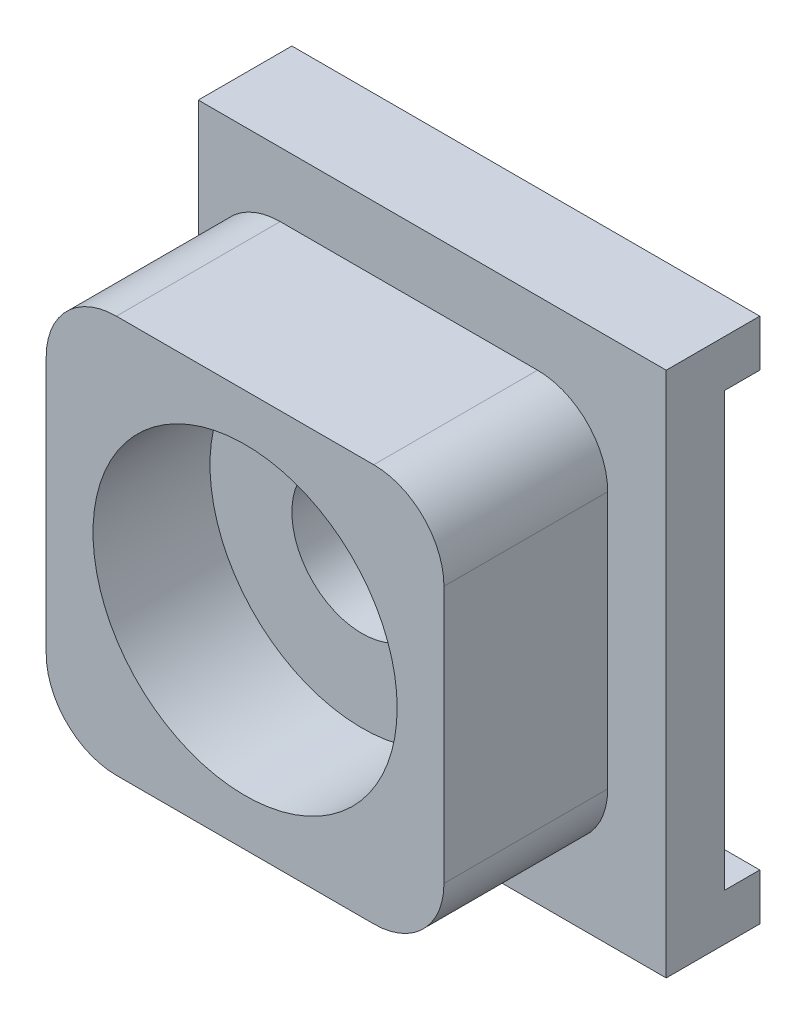
ISO-10303-21;
HEADER;
FILE_DESCRIPTION(('STEP AP214'),'2;1');
FILE_NAME('part.step','',(''),(''),'','','');
FILE_SCHEMA(('AUTOMOTIVE_DESIGN { 1 0 10303 214 1 1 1 1 }'));
ENDSEC;
DATA;
#1=APPLICATION_CONTEXT('core data for automotive mechanical design processes');
#2=APPLICATION_PROTOCOL_DEFINITION('international standard','automotive_design',2000,#1);
#3=PRODUCT_CONTEXT('',#1,'mechanical');
#4=PRODUCT('Part','Part','',(#3));
#5=PRODUCT_RELATED_PRODUCT_CATEGORY('part','',(#4));
#6=PRODUCT_DEFINITION_FORMATION('','',#4);
#7=PRODUCT_DEFINITION_CONTEXT('part definition',#1,'design');
#8=PRODUCT_DEFINITION('design','',#6,#7);
#9=PRODUCT_DEFINITION_SHAPE('','',#8);
#10=(LENGTH_UNIT() NAMED_UNIT(*) SI_UNIT(.MILLI.,.METRE.));
#11=(NAMED_UNIT(*) PLANE_ANGLE_UNIT() SI_UNIT($,.RADIAN.));
#12=(NAMED_UNIT(*) SI_UNIT($,.STERADIAN.) SOLID_ANGLE_UNIT());
#13=UNCERTAINTY_MEASURE_WITH_UNIT(LENGTH_MEASURE(1.E-05),#10,'distance_accuracy_value','');
#14=(GEOMETRIC_REPRESENTATION_CONTEXT(3) GLOBAL_UNCERTAINTY_ASSIGNED_CONTEXT((#13)) GLOBAL_UNIT_ASSIGNED_CONTEXT((#10,
#11,#12)) REPRESENTATION_CONTEXT('',''));
#15=CARTESIAN_POINT('',(0.,0.,0.));
#16=DIRECTION('',(0.,0.,1.));
#17=DIRECTION('',(1.,0.,0.));
#18=AXIS2_PLACEMENT_3D('',#15,#16,#17);
#19=CARTESIAN_POINT('',(9.,-32.1161163460147,-3.28538808507393));
#20=DIRECTION('',(0.,0.,1.));
#21=DIRECTION('',(1.,0.,0.));
#22=AXIS2_PLACEMENT_3D('',#19,#20,#21);
#23=CYLINDRICAL_SURFACE('',#22,3.);
#24=CARTESIAN_POINT('',(9.,-32.1161163460147,-2.78538808507393));
#25=DIRECTION('',(0.,0.,1.));
#26=DIRECTION('',(0.,-1.,0.));
#27=AXIS2_PLACEMENT_3D('',#24,#25,#26);
#28=CIRCLE('',#27,3.);
#29=CARTESIAN_POINT('',(9.,-35.1161163460147,-2.78538808507393));
#30=VERTEX_POINT('',#29);
#31=EDGE_CURVE('E245',#30,#30,#28,.T.);
#32=ORIENTED_EDGE('',*,*,#31,.F.);
#33=EDGE_LOOP('',(#32));
#34=FACE_BOUND('',#33,.T.);
#35=CARTESIAN_POINT('',(9.,-32.1161163460147,1.71461191492607));
#36=DIRECTION('',(0.,0.,1.));
#37=DIRECTION('',(1.,0.,0.));
#38=AXIS2_PLACEMENT_3D('',#35,#36,#37);
#39=CIRCLE('',#38,3.);
#40=CARTESIAN_POINT('',(12.,-32.1161163460147,1.71461191492607));
#41=VERTEX_POINT('',#40);
#42=EDGE_CURVE('E178',#41,#41,#39,.F.);
#43=ORIENTED_EDGE('',*,*,#42,.F.);
#44=EDGE_LOOP('',(#43));
#45=FACE_BOUND('',#44,.T.);
#46=ADVANCED_FACE('F33',(#34,#45),#23,.F.);
#47=CARTESIAN_POINT('',(20.,-20.8661163460147,-0.285388085073932));
#48=DIRECTION('',(0.,0.,-1.));
#49=DIRECTION('',(0.,1.,0.));
#50=AXIS2_PLACEMENT_3D('',#47,#48,#49);
#51=PLANE('',#50);
#52=DIRECTION('',(0.,-1.,0.));
#53=VECTOR('',#52,1.);
#54=CARTESIAN_POINT('',(0.,-20.8661163460147,-0.285388085073932));
#55=LINE('',#54,#53);
#56=CARTESIAN_POINT('',(0.,-20.8661163460147,-0.285388085073932));
#57=VERTEX_POINT('',#56);
#58=CARTESIAN_POINT('',(0.,-43.3661163460147,-0.285388085073934));
#59=VERTEX_POINT('',#58);
#60=EDGE_CURVE('E272',#57,#59,#55,.T.);
#61=ORIENTED_EDGE('',*,*,#60,.T.);
#62=DIRECTION('',(-1.,0.,0.));
#63=VECTOR('',#62,1.);
#64=CARTESIAN_POINT('',(20.,-43.3661163460147,-0.285388085073934));
#65=LINE('',#64,#63);
#66=CARTESIAN_POINT('',(20.,-43.3661163460147,-0.285388085073934));
#67=VERTEX_POINT('',#66);
#68=EDGE_CURVE('E286',#67,#59,#65,.T.);
#69=ORIENTED_EDGE('',*,*,#68,.F.);
#70=DIRECTION('',(0.,-1.,0.));
#71=VECTOR('',#70,1.);
#72=CARTESIAN_POINT('',(20.,-20.8661163460147,-0.285388085073932));
#73=LINE('',#72,#71);
#74=CARTESIAN_POINT('',(20.,-20.8661163460147,-0.285388085073932));
#75=VERTEX_POINT('',#74);
#76=EDGE_CURVE('E257',#75,#67,#73,.T.);
#77=ORIENTED_EDGE('',*,*,#76,.F.);
#78=DIRECTION('',(-1.,0.,0.));
#79=VECTOR('',#78,1.);
#80=CARTESIAN_POINT('',(20.,-20.8661163460147,-0.285388085073932));
#81=LINE('',#80,#79);
#82=EDGE_CURVE('E289',#75,#57,#81,.T.);
#83=ORIENTED_EDGE('',*,*,#82,.T.);
#84=EDGE_LOOP('',(#61,#69,#77,#83));
#85=FACE_BOUND('',#84,.T.);
#86=DIRECTION('',(0.,-1.,0.));
#87=VECTOR('',#86,1.);
#88=CARTESIAN_POINT('',(0.5,-40.6161163460147,-0.285388085073929));
#89=LINE('',#88,#87);
#90=CARTESIAN_POINT('',(0.5,-26.6161163460147,-0.285388085073929));
#91=VERTEX_POINT('',#90);
#92=CARTESIAN_POINT('',(0.5,-37.6161163460147,-0.285388085073929));
#93=VERTEX_POINT('',#92);
#94=EDGE_CURVE('E180',#91,#93,#89,.T.);
#95=ORIENTED_EDGE('',*,*,#94,.F.);
#96=CARTESIAN_POINT('',(3.5,-26.6161163460147,-0.285388085073932));
#97=DIRECTION('',(0.,0.,-1.));
#98=DIRECTION('',(0.,1.,0.));
#99=AXIS2_PLACEMENT_3D('',#96,#97,#98);
#100=CIRCLE('',#99,3.);
#101=CARTESIAN_POINT('',(3.5,-23.6161163460147,-0.285388085073929));
#102=VERTEX_POINT('',#101);
#103=EDGE_CURVE('E41',#91,#102,#100,.T.);
#104=ORIENTED_EDGE('',*,*,#103,.T.);
#105=DIRECTION('',(-1.,0.,0.));
#106=VECTOR('',#105,1.);
#107=CARTESIAN_POINT('',(0.5,-23.6161163460147,-0.285388085073929));
#108=LINE('',#107,#106);
#109=CARTESIAN_POINT('',(14.5,-23.6161163460147,-0.285388085073929));
#110=VERTEX_POINT('',#109);
#111=EDGE_CURVE('E213',#110,#102,#108,.T.);
#112=ORIENTED_EDGE('',*,*,#111,.F.);
#113=CARTESIAN_POINT('',(14.5,-26.6161163460147,-0.285388085073932));
#114=DIRECTION('',(0.,0.,-1.));
#115=DIRECTION('',(0.,1.,0.));
#116=AXIS2_PLACEMENT_3D('',#113,#114,#115);
#117=CIRCLE('',#116,3.);
#118=CARTESIAN_POINT('',(17.5,-26.6161163460147,-0.285388085073929));
#119=VERTEX_POINT('',#118);
#120=EDGE_CURVE('E209',#110,#119,#117,.T.);
#121=ORIENTED_EDGE('',*,*,#120,.T.);
#122=DIRECTION('',(0.,1.,0.));
#123=VECTOR('',#122,1.);
#124=CARTESIAN_POINT('',(17.5,-40.6161163460147,-0.285388085073929));
#125=LINE('',#124,#123);
#126=CARTESIAN_POINT('',(17.5,-37.6161163460147,-0.285388085073929));
#127=VERTEX_POINT('',#126);
#128=EDGE_CURVE('E220',#127,#119,#125,.T.);
#129=ORIENTED_EDGE('',*,*,#128,.F.);
#130=CARTESIAN_POINT('',(14.5,-37.6161163460147,-0.285388085073933));
#131=DIRECTION('',(0.,0.,-1.));
#132=DIRECTION('',(0.,1.,0.));
#133=AXIS2_PLACEMENT_3D('',#130,#131,#132);
#134=CIRCLE('',#133,3.);
#135=CARTESIAN_POINT('',(14.5,-40.6161163460147,-0.285388085073929));
#136=VERTEX_POINT('',#135);
#137=EDGE_CURVE('E207',#127,#136,#134,.T.);
#138=ORIENTED_EDGE('',*,*,#137,.T.);
#139=DIRECTION('',(1.,0.,0.));
#140=VECTOR('',#139,1.);
#141=CARTESIAN_POINT('',(0.5,-40.6161163460147,-0.285388085073929));
#142=LINE('',#141,#140);
#143=CARTESIAN_POINT('',(3.5,-40.6161163460147,-0.285388085073929));
#144=VERTEX_POINT('',#143);
#145=EDGE_CURVE('E247',#144,#136,#142,.T.);
#146=ORIENTED_EDGE('',*,*,#145,.F.);
#147=CARTESIAN_POINT('',(3.5,-37.6161163460147,-0.285388085073933));
#148=DIRECTION('',(0.,0.,-1.));
#149=DIRECTION('',(0.,1.,0.));
#150=AXIS2_PLACEMENT_3D('',#147,#148,#149);
#151=CIRCLE('',#150,3.);
#152=EDGE_CURVE('E11',#144,#93,#151,.T.);
#153=ORIENTED_EDGE('',*,*,#152,.T.);
#154=EDGE_LOOP('',(#95,#104,#112,#121,#129,#138,#146,#153));
#155=FACE_BOUND('',#154,.T.);
#156=ADVANCED_FACE('F212',(#85,#155),#51,.F.);
#157=CARTESIAN_POINT('',(20.,-41.3661163460147,-2.78538808507393));
#158=DIRECTION('',(0.,0.,1.));
#159=DIRECTION('',(0.,-1.,0.));
#160=AXIS2_PLACEMENT_3D('',#157,#158,#159);
#161=PLANE('',#160);
#162=ORIENTED_EDGE('',*,*,#31,.T.);
#163=EDGE_LOOP('',(#162));
#164=FACE_BOUND('',#163,.T.);
#165=DIRECTION('',(0.,1.,0.));
#166=VECTOR('',#165,1.);
#167=CARTESIAN_POINT('',(0.,-41.3661163460147,-2.78538808507393));
#168=LINE('',#167,#166);
#169=CARTESIAN_POINT('',(0.,-41.3661163460147,-2.78538808507393));
#170=VERTEX_POINT('',#169);
#171=CARTESIAN_POINT('',(0.,-22.8661163460147,-2.78538808507393));
#172=VERTEX_POINT('',#171);
#173=EDGE_CURVE('E169',#170,#172,#168,.T.);
#174=ORIENTED_EDGE('',*,*,#173,.T.);
#175=DIRECTION('',(-1.,0.,0.));
#176=VECTOR('',#175,1.);
#177=CARTESIAN_POINT('',(20.,-22.8661163460147,-2.78538808507393));
#178=LINE('',#177,#176);
#179=CARTESIAN_POINT('',(20.,-22.8661163460147,-2.78538808507393));
#180=VERTEX_POINT('',#179);
#181=EDGE_CURVE('E149',#180,#172,#178,.T.);
#182=ORIENTED_EDGE('',*,*,#181,.F.);
#183=DIRECTION('',(0.,1.,0.));
#184=VECTOR('',#183,1.);
#185=CARTESIAN_POINT('',(20.,-41.3661163460147,-2.78538808507393));
#186=LINE('',#185,#184);
#187=CARTESIAN_POINT('',(20.,-41.3661163460147,-2.78538808507393));
#188=VERTEX_POINT('',#187);
#189=EDGE_CURVE('E156',#188,#180,#186,.T.);
#190=ORIENTED_EDGE('',*,*,#189,.F.);
#191=DIRECTION('',(-1.,0.,0.));
#192=VECTOR('',#191,1.);
#193=CARTESIAN_POINT('',(20.,-41.3661163460147,-2.78538808507393));
#194=LINE('',#193,#192);
#195=EDGE_CURVE('E264',#188,#170,#194,.T.);
#196=ORIENTED_EDGE('',*,*,#195,.T.);
#197=EDGE_LOOP('',(#174,#182,#190,#196));
#198=FACE_BOUND('',#197,.T.);
#199=ADVANCED_FACE('F167',(#164,#198),#161,.F.);
#200=CARTESIAN_POINT('',(20.,-22.8661163460147,-2.78538808507393));
#201=DIRECTION('',(0.,1.,0.));
#202=DIRECTION('',(0.,0.,1.));
#203=AXIS2_PLACEMENT_3D('',#200,#201,#202);
#204=PLANE('',#203);
#205=DIRECTION('',(0.,0.,-1.));
#206=VECTOR('',#205,1.);
#207=CARTESIAN_POINT('',(0.,-22.8661163460147,-2.78538808507393));
#208=LINE('',#207,#206);
#209=CARTESIAN_POINT('',(0.,-22.8661163460147,-4.28538808507393));
#210=VERTEX_POINT('',#209);
#211=EDGE_CURVE('E266',#172,#210,#208,.T.);
#212=ORIENTED_EDGE('',*,*,#211,.T.);
#213=DIRECTION('',(-1.,0.,0.));
#214=VECTOR('',#213,1.);
#215=CARTESIAN_POINT('',(20.,-22.8661163460147,-4.28538808507393));
#216=LINE('',#215,#214);
#217=CARTESIAN_POINT('',(20.,-22.8661163460147,-4.28538808507393));
#218=VERTEX_POINT('',#217);
#219=EDGE_CURVE('E152',#218,#210,#216,.T.);
#220=ORIENTED_EDGE('',*,*,#219,.F.);
#221=DIRECTION('',(0.,0.,-1.));
#222=VECTOR('',#221,1.);
#223=CARTESIAN_POINT('',(20.,-22.8661163460147,-2.78538808507393));
#224=LINE('',#223,#222);
#225=EDGE_CURVE('E145',#180,#218,#224,.T.);
#226=ORIENTED_EDGE('',*,*,#225,.F.);
#227=ORIENTED_EDGE('',*,*,#181,.T.);
#228=EDGE_LOOP('',(#212,#220,#226,#227));
#229=FACE_BOUND('',#228,.T.);
#230=ADVANCED_FACE('F147',(#229),#204,.F.);
#231=CARTESIAN_POINT('',(20.,-22.8661163460147,-4.28538808507393));
#232=DIRECTION('',(0.,0.,1.));
#233=DIRECTION('',(1.,0.,0.));
#234=AXIS2_PLACEMENT_3D('',#231,#232,#233);
#235=PLANE('',#234);
#236=DIRECTION('',(0.,1.,0.));
#237=VECTOR('',#236,1.);
#238=CARTESIAN_POINT('',(0.,-22.8661163460147,-4.28538808507393));
#239=LINE('',#238,#237);
#240=CARTESIAN_POINT('',(0.,-20.8661163460147,-4.28538808507393));
#241=VERTEX_POINT('',#240);
#242=EDGE_CURVE('E268',#210,#241,#239,.T.);
#243=ORIENTED_EDGE('',*,*,#242,.T.);
#244=DIRECTION('',(-1.,0.,0.));
#245=VECTOR('',#244,1.);
#246=CARTESIAN_POINT('',(20.,-20.8661163460147,-4.28538808507393));
#247=LINE('',#246,#245);
#248=CARTESIAN_POINT('',(20.,-20.8661163460147,-4.28538808507393));
#249=VERTEX_POINT('',#248);
#250=EDGE_CURVE('E174',#249,#241,#247,.T.);
#251=ORIENTED_EDGE('',*,*,#250,.F.);
#252=DIRECTION('',(0.,1.,0.));
#253=VECTOR('',#252,1.);
#254=CARTESIAN_POINT('',(20.,-22.8661163460147,-4.28538808507393));
#255=LINE('',#254,#253);
#256=EDGE_CURVE('E155',#218,#249,#255,.T.);
#257=ORIENTED_EDGE('',*,*,#256,.F.);
#258=ORIENTED_EDGE('',*,*,#219,.T.);
#259=EDGE_LOOP('',(#243,#251,#257,#258));
#260=FACE_BOUND('',#259,.T.);
#261=ADVANCED_FACE('F314',(#260),#235,.F.);
#262=CARTESIAN_POINT('',(20.,-20.8661163460147,-4.28538808507393));
#263=DIRECTION('',(0.,-1.,0.));
#264=DIRECTION('',(0.,0.,-1.));
#265=AXIS2_PLACEMENT_3D('',#262,#263,#264);
#266=PLANE('',#265);
#267=DIRECTION('',(0.,0.,1.));
#268=VECTOR('',#267,1.);
#269=CARTESIAN_POINT('',(0.,-20.8661163460147,-4.28538808507393));
#270=LINE('',#269,#268);
#271=EDGE_CURVE('E270',#241,#57,#270,.T.);
#272=ORIENTED_EDGE('',*,*,#271,.T.);
#273=ORIENTED_EDGE('',*,*,#82,.F.);
#274=DIRECTION('',(0.,0.,1.));
#275=VECTOR('',#274,1.);
#276=CARTESIAN_POINT('',(20.,-20.8661163460147,-4.28538808507393));
#277=LINE('',#276,#275);
#278=EDGE_CURVE('E255',#249,#75,#277,.T.);
#279=ORIENTED_EDGE('',*,*,#278,.F.);
#280=ORIENTED_EDGE('',*,*,#250,.T.);
#281=EDGE_LOOP('',(#272,#273,#279,#280));
#282=FACE_BOUND('',#281,.T.);
#283=ADVANCED_FACE('F296',(#282),#266,.F.);
#284=CARTESIAN_POINT('',(20.,-43.3661163460147,-0.285388085073934));
#285=DIRECTION('',(0.,1.,0.));
#286=DIRECTION('',(0.,0.,1.));
#287=AXIS2_PLACEMENT_3D('',#284,#285,#286);
#288=PLANE('',#287);
#289=DIRECTION('',(0.,0.,-1.));
#290=VECTOR('',#289,1.);
#291=CARTESIAN_POINT('',(0.,-43.3661163460147,-0.285388085073934));
#292=LINE('',#291,#290);
#293=CARTESIAN_POINT('',(0.,-43.3661163460147,-4.28538808507393));
#294=VERTEX_POINT('',#293);
#295=EDGE_CURVE('E274',#59,#294,#292,.T.);
#296=ORIENTED_EDGE('',*,*,#295,.T.);
#297=DIRECTION('',(-1.,0.,0.));
#298=VECTOR('',#297,1.);
#299=CARTESIAN_POINT('',(20.,-43.3661163460147,-4.28538808507393));
#300=LINE('',#299,#298);
#301=CARTESIAN_POINT('',(20.,-43.3661163460147,-4.28538808507393));
#302=VERTEX_POINT('',#301);
#303=EDGE_CURVE('E283',#302,#294,#300,.T.);
#304=ORIENTED_EDGE('',*,*,#303,.F.);
#305=DIRECTION('',(0.,0.,-1.));
#306=VECTOR('',#305,1.);
#307=CARTESIAN_POINT('',(20.,-43.3661163460147,-0.285388085073934));
#308=LINE('',#307,#306);
#309=EDGE_CURVE('E259',#67,#302,#308,.T.);
#310=ORIENTED_EDGE('',*,*,#309,.F.);
#311=ORIENTED_EDGE('',*,*,#68,.T.);
#312=EDGE_LOOP('',(#296,#304,#310,#311));
#313=FACE_BOUND('',#312,.T.);
#314=ADVANCED_FACE('F310',(#313),#288,.F.);
#315=CARTESIAN_POINT('',(20.,-43.3661163460147,-4.28538808507393));
#316=DIRECTION('',(0.,0.,1.));
#317=DIRECTION('',(1.,0.,0.));
#318=AXIS2_PLACEMENT_3D('',#315,#316,#317);
#319=PLANE('',#318);
#320=DIRECTION('',(0.,1.,0.));
#321=VECTOR('',#320,1.);
#322=CARTESIAN_POINT('',(0.,-43.3661163460147,-4.28538808507393));
#323=LINE('',#322,#321);
#324=CARTESIAN_POINT('',(0.,-41.3661163460147,-4.28538808507393));
#325=VERTEX_POINT('',#324);
#326=EDGE_CURVE('E276',#294,#325,#323,.T.);
#327=ORIENTED_EDGE('',*,*,#326,.T.);
#328=DIRECTION('',(-1.,0.,0.));
#329=VECTOR('',#328,1.);
#330=CARTESIAN_POINT('',(20.,-41.3661163460147,-4.28538808507393));
#331=LINE('',#330,#329);
#332=CARTESIAN_POINT('',(20.,-41.3661163460147,-4.28538808507393));
#333=VERTEX_POINT('',#332);
#334=EDGE_CURVE('E280',#333,#325,#331,.T.);
#335=ORIENTED_EDGE('',*,*,#334,.F.);
#336=DIRECTION('',(0.,1.,0.));
#337=VECTOR('',#336,1.);
#338=CARTESIAN_POINT('',(20.,-43.3661163460147,-4.28538808507393));
#339=LINE('',#338,#337);
#340=EDGE_CURVE('E261',#302,#333,#339,.T.);
#341=ORIENTED_EDGE('',*,*,#340,.F.);
#342=ORIENTED_EDGE('',*,*,#303,.T.);
#343=EDGE_LOOP('',(#327,#335,#341,#342));
#344=FACE_BOUND('',#343,.T.);
#345=ADVANCED_FACE('F342',(#344),#319,.F.);
#346=CARTESIAN_POINT('',(20.,-41.3661163460147,-4.28538808507393));
#347=DIRECTION('',(0.,-1.,0.));
#348=DIRECTION('',(0.,0.,-1.));
#349=AXIS2_PLACEMENT_3D('',#346,#347,#348);
#350=PLANE('',#349);
#351=DIRECTION('',(0.,0.,1.));
#352=VECTOR('',#351,1.);
#353=CARTESIAN_POINT('',(0.,-41.3661163460147,-4.28538808507393));
#354=LINE('',#353,#352);
#355=EDGE_CURVE('E165',#325,#170,#354,.T.);
#356=ORIENTED_EDGE('',*,*,#355,.T.);
#357=ORIENTED_EDGE('',*,*,#195,.F.);
#358=DIRECTION('',(0.,0.,1.));
#359=VECTOR('',#358,1.);
#360=CARTESIAN_POINT('',(20.,-41.3661163460147,-4.28538808507393));
#361=LINE('',#360,#359);
#362=EDGE_CURVE('E161',#333,#188,#361,.T.);
#363=ORIENTED_EDGE('',*,*,#362,.F.);
#364=ORIENTED_EDGE('',*,*,#334,.T.);
#365=EDGE_LOOP('',(#356,#357,#363,#364));
#366=FACE_BOUND('',#365,.T.);
#367=ADVANCED_FACE('F337',(#366),#350,.F.);
#368=CARTESIAN_POINT('',(20.,0.,0.));
#369=DIRECTION('',(-1.,0.,0.));
#370=DIRECTION('',(0.,0.,1.));
#371=AXIS2_PLACEMENT_3D('',#368,#369,#370);
#372=PLANE('',#371);
#373=ORIENTED_EDGE('',*,*,#189,.T.);
#374=ORIENTED_EDGE('',*,*,#225,.T.);
#375=ORIENTED_EDGE('',*,*,#256,.T.);
#376=ORIENTED_EDGE('',*,*,#278,.T.);
#377=ORIENTED_EDGE('',*,*,#76,.T.);
#378=ORIENTED_EDGE('',*,*,#309,.T.);
#379=ORIENTED_EDGE('',*,*,#340,.T.);
#380=ORIENTED_EDGE('',*,*,#362,.T.);
#381=EDGE_LOOP('',(#373,#374,#375,#376,#377,#378,#379,#380));
#382=FACE_BOUND('',#381,.T.);
#383=ADVANCED_FACE('F159',(#382),#372,.F.);
#384=CARTESIAN_POINT('',(0.,0.,0.));
#385=DIRECTION('',(-1.,0.,0.));
#386=DIRECTION('',(0.,0.,1.));
#387=AXIS2_PLACEMENT_3D('',#384,#385,#386);
#388=PLANE('',#387);
#389=ORIENTED_EDGE('',*,*,#173,.F.);
#390=ORIENTED_EDGE('',*,*,#355,.F.);
#391=ORIENTED_EDGE('',*,*,#326,.F.);
#392=ORIENTED_EDGE('',*,*,#295,.F.);
#393=ORIENTED_EDGE('',*,*,#60,.F.);
#394=ORIENTED_EDGE('',*,*,#271,.F.);
#395=ORIENTED_EDGE('',*,*,#242,.F.);
#396=ORIENTED_EDGE('',*,*,#211,.F.);
#397=EDGE_LOOP('',(#389,#390,#391,#392,#393,#394,#395,#396));
#398=FACE_BOUND('',#397,.T.);
#399=ADVANCED_FACE('F302',(#398),#388,.T.);
#400=CARTESIAN_POINT('',(0.,0.,6.71461191492607));
#401=DIRECTION('',(0.,0.,-1.));
#402=DIRECTION('',(-1.,0.,0.));
#403=AXIS2_PLACEMENT_3D('',#400,#401,#402);
#404=PLANE('',#403);
#405=CARTESIAN_POINT('',(9.,-32.1161163460147,6.71461191492607));
#406=DIRECTION('',(0.,0.,1.));
#407=DIRECTION('',(1.,0.,0.));
#408=AXIS2_PLACEMENT_3D('',#405,#406,#407);
#409=CIRCLE('',#408,6.5);
#410=CARTESIAN_POINT('',(15.5,-32.1161163460147,6.71461191492607));
#411=VERTEX_POINT('',#410);
#412=EDGE_CURVE('E239',#411,#411,#409,.T.);
#413=ORIENTED_EDGE('',*,*,#412,.F.);
#414=EDGE_LOOP('',(#413));
#415=FACE_BOUND('',#414,.T.);
#416=DIRECTION('',(1.,0.,0.));
#417=VECTOR('',#416,1.);
#418=CARTESIAN_POINT('',(0.5,-40.6161163460147,6.71461191492607));
#419=LINE('',#418,#417);
#420=CARTESIAN_POINT('',(3.5,-40.6161163460147,6.71461191492607));
#421=VERTEX_POINT('',#420);
#422=CARTESIAN_POINT('',(14.5,-40.6161163460147,6.71461191492607));
#423=VERTEX_POINT('',#422);
#424=EDGE_CURVE('E234',#421,#423,#419,.T.);
#425=ORIENTED_EDGE('',*,*,#424,.T.);
#426=CARTESIAN_POINT('',(14.5,-37.6161163460147,6.71461191492607));
#427=DIRECTION('',(0.,0.,-1.));
#428=DIRECTION('',(-1.,0.,0.));
#429=AXIS2_PLACEMENT_3D('',#426,#427,#428);
#430=CIRCLE('',#429,3.);
#431=CARTESIAN_POINT('',(17.5,-37.6161163460147,6.71461191492607));
#432=VERTEX_POINT('',#431);
#433=EDGE_CURVE('E196',#423,#432,#430,.F.);
#434=ORIENTED_EDGE('',*,*,#433,.T.);
#435=DIRECTION('',(0.,1.,0.));
#436=VECTOR('',#435,1.);
#437=CARTESIAN_POINT('',(17.5,-40.6161163460147,6.71461191492607));
#438=LINE('',#437,#436);
#439=CARTESIAN_POINT('',(17.5,-26.6161163460147,6.71461191492607));
#440=VERTEX_POINT('',#439);
#441=EDGE_CURVE('E236',#432,#440,#438,.T.);
#442=ORIENTED_EDGE('',*,*,#441,.T.);
#443=CARTESIAN_POINT('',(14.5,-26.6161163460147,6.71461191492607));
#444=DIRECTION('',(0.,0.,-1.));
#445=DIRECTION('',(-1.,0.,0.));
#446=AXIS2_PLACEMENT_3D('',#443,#444,#445);
#447=CIRCLE('',#446,3.);
#448=CARTESIAN_POINT('',(14.5,-23.6161163460147,6.71461191492607));
#449=VERTEX_POINT('',#448);
#450=EDGE_CURVE('E194',#440,#449,#447,.F.);
#451=ORIENTED_EDGE('',*,*,#450,.T.);
#452=DIRECTION('',(-1.,0.,0.));
#453=VECTOR('',#452,1.);
#454=CARTESIAN_POINT('',(0.5,-23.6161163460147,6.71461191492607));
#455=LINE('',#454,#453);
#456=CARTESIAN_POINT('',(3.5,-23.6161163460147,6.71461191492607));
#457=VERTEX_POINT('',#456);
#458=EDGE_CURVE('E230',#449,#457,#455,.T.);
#459=ORIENTED_EDGE('',*,*,#458,.T.);
#460=CARTESIAN_POINT('',(3.5,-26.6161163460147,6.71461191492607));
#461=DIRECTION('',(0.,0.,-1.));
#462=DIRECTION('',(-1.,0.,0.));
#463=AXIS2_PLACEMENT_3D('',#460,#461,#462);
#464=CIRCLE('',#463,3.);
#465=CARTESIAN_POINT('',(0.5,-26.6161163460147,6.71461191492607));
#466=VERTEX_POINT('',#465);
#467=EDGE_CURVE('E192',#457,#466,#464,.F.);
#468=ORIENTED_EDGE('',*,*,#467,.T.);
#469=DIRECTION('',(0.,-1.,0.));
#470=VECTOR('',#469,1.);
#471=CARTESIAN_POINT('',(0.5,-40.6161163460147,6.71461191492607));
#472=LINE('',#471,#470);
#473=CARTESIAN_POINT('',(0.5,-37.6161163460147,6.71461191492607));
#474=VERTEX_POINT('',#473);
#475=EDGE_CURVE('E219',#466,#474,#472,.T.);
#476=ORIENTED_EDGE('',*,*,#475,.T.);
#477=CARTESIAN_POINT('',(3.5,-37.6161163460147,6.71461191492607));
#478=DIRECTION('',(0.,0.,-1.));
#479=DIRECTION('',(-1.,0.,0.));
#480=AXIS2_PLACEMENT_3D('',#477,#478,#479);
#481=CIRCLE('',#480,3.);
#482=EDGE_CURVE('E190',#474,#421,#481,.F.);
#483=ORIENTED_EDGE('',*,*,#482,.T.);
#484=EDGE_LOOP('',(#425,#434,#442,#451,#459,#468,#476,#483));
#485=FACE_BOUND('',#484,.T.);
#486=ADVANCED_FACE('F228',(#415,#485),#404,.F.);
#487=CARTESIAN_POINT('',(0.5,-40.6161163460147,6.71461191492607));
#488=DIRECTION('',(1.,0.,0.));
#489=DIRECTION('',(0.,0.,-1.));
#490=AXIS2_PLACEMENT_3D('',#487,#488,#489);
#491=PLANE('',#490);
#492=ORIENTED_EDGE('',*,*,#475,.F.);
#493=DIRECTION('',(0.,0.,-1.));
#494=VECTOR('',#493,1.);
#495=CARTESIAN_POINT('',(0.5,-26.6161163460147,6.71461191492607));
#496=LINE('',#495,#494);
#497=EDGE_CURVE('E205',#466,#91,#496,.T.);
#498=ORIENTED_EDGE('',*,*,#497,.T.);
#499=ORIENTED_EDGE('',*,*,#94,.T.);
#500=DIRECTION('',(0.,0.,-1.));
#501=VECTOR('',#500,1.);
#502=CARTESIAN_POINT('',(0.5,-37.6161163460147,6.71461191492607));
#503=LINE('',#502,#501);
#504=EDGE_CURVE('E203',#93,#474,#503,.F.);
#505=ORIENTED_EDGE('',*,*,#504,.T.);
#506=EDGE_LOOP('',(#492,#498,#499,#505));
#507=FACE_BOUND('',#506,.T.);
#508=ADVANCED_FACE('F232',(#507),#491,.F.);
#509=CARTESIAN_POINT('',(0.5,-40.6161163460147,6.71461191492607));
#510=DIRECTION('',(0.,1.,0.));
#511=DIRECTION('',(0.,0.,1.));
#512=AXIS2_PLACEMENT_3D('',#509,#510,#511);
#513=PLANE('',#512);
#514=ORIENTED_EDGE('',*,*,#145,.T.);
#515=DIRECTION('',(0.,0.,-1.));
#516=VECTOR('',#515,1.);
#517=CARTESIAN_POINT('',(14.5,-40.6161163460147,6.71461191492607));
#518=LINE('',#517,#516);
#519=EDGE_CURVE('E188',#136,#423,#518,.F.);
#520=ORIENTED_EDGE('',*,*,#519,.T.);
#521=ORIENTED_EDGE('',*,*,#424,.F.);
#522=DIRECTION('',(0.,0.,-1.));
#523=VECTOR('',#522,1.);
#524=CARTESIAN_POINT('',(3.5,-40.6161163460147,6.71461191492607));
#525=LINE('',#524,#523);
#526=EDGE_CURVE('E185',#421,#144,#525,.T.);
#527=ORIENTED_EDGE('',*,*,#526,.T.);
#528=EDGE_LOOP('',(#514,#520,#521,#527));
#529=FACE_BOUND('',#528,.T.);
#530=ADVANCED_FACE('F383',(#529),#513,.F.);
#531=CARTESIAN_POINT('',(17.5,-40.6161163460147,6.71461191492607));
#532=DIRECTION('',(-1.,0.,0.));
#533=DIRECTION('',(0.,0.,1.));
#534=AXIS2_PLACEMENT_3D('',#531,#532,#533);
#535=PLANE('',#534);
#536=ORIENTED_EDGE('',*,*,#441,.F.);
#537=DIRECTION('',(0.,0.,-1.));
#538=VECTOR('',#537,1.);
#539=CARTESIAN_POINT('',(17.5,-37.6161163460147,6.71461191492607));
#540=LINE('',#539,#538);
#541=EDGE_CURVE('E172',#432,#127,#540,.T.);
#542=ORIENTED_EDGE('',*,*,#541,.T.);
#543=ORIENTED_EDGE('',*,*,#128,.T.);
#544=DIRECTION('',(0.,0.,-1.));
#545=VECTOR('',#544,1.);
#546=CARTESIAN_POINT('',(17.5,-26.6161163460147,6.71461191492607));
#547=LINE('',#546,#545);
#548=EDGE_CURVE('E170',#119,#440,#547,.F.);
#549=ORIENTED_EDGE('',*,*,#548,.T.);
#550=EDGE_LOOP('',(#536,#542,#543,#549));
#551=FACE_BOUND('',#550,.T.);
#552=ADVANCED_FACE('F389',(#551),#535,.F.);
#553=CARTESIAN_POINT('',(0.5,-23.6161163460147,6.71461191492607));
#554=DIRECTION('',(0.,-1.,0.));
#555=DIRECTION('',(0.,0.,-1.));
#556=AXIS2_PLACEMENT_3D('',#553,#554,#555);
#557=PLANE('',#556);
#558=ORIENTED_EDGE('',*,*,#458,.F.);
#559=DIRECTION('',(0.,0.,-1.));
#560=VECTOR('',#559,1.);
#561=CARTESIAN_POINT('',(14.5,-23.6161163460147,6.71461191492607));
#562=LINE('',#561,#560);
#563=EDGE_CURVE('E200',#449,#110,#562,.T.);
#564=ORIENTED_EDGE('',*,*,#563,.T.);
#565=ORIENTED_EDGE('',*,*,#111,.T.);
#566=DIRECTION('',(0.,0.,-1.));
#567=VECTOR('',#566,1.);
#568=CARTESIAN_POINT('',(3.5,-23.6161163460147,6.71461191492607));
#569=LINE('',#568,#567);
#570=EDGE_CURVE('E198',#102,#457,#569,.F.);
#571=ORIENTED_EDGE('',*,*,#570,.T.);
#572=EDGE_LOOP('',(#558,#564,#565,#571));
#573=FACE_BOUND('',#572,.T.);
#574=ADVANCED_FACE('F216',(#573),#557,.F.);
#575=CARTESIAN_POINT('',(9.,-32.1161163460147,1.71461191492607));
#576=DIRECTION('',(0.,0.,1.));
#577=DIRECTION('',(1.,0.,0.));
#578=AXIS2_PLACEMENT_3D('',#575,#576,#577);
#579=PLANE('',#578);
#580=CARTESIAN_POINT('',(9.,-32.1161163460147,1.71461191492607));
#581=DIRECTION('',(0.,0.,1.));
#582=DIRECTION('',(1.,0.,0.));
#583=AXIS2_PLACEMENT_3D('',#580,#581,#582);
#584=CIRCLE('',#583,6.5);
#585=CARTESIAN_POINT('',(15.5,-32.1161163460147,1.71461191492607));
#586=VERTEX_POINT('',#585);
#587=EDGE_CURVE('E181',#586,#586,#584,.T.);
#588=ORIENTED_EDGE('',*,*,#587,.T.);
#589=EDGE_LOOP('',(#588));
#590=FACE_BOUND('',#589,.T.);
#591=ORIENTED_EDGE('',*,*,#42,.T.);
#592=EDGE_LOOP('',(#591));
#593=FACE_BOUND('',#592,.T.);
#594=ADVANCED_FACE('F403',(#590,#593),#579,.T.);
#595=CARTESIAN_POINT('',(9.,-32.1161163460147,1.71461191492607));
#596=DIRECTION('',(0.,0.,1.));
#597=DIRECTION('',(1.,0.,0.));
#598=AXIS2_PLACEMENT_3D('',#595,#596,#597);
#599=CYLINDRICAL_SURFACE('',#598,6.5);
#600=ORIENTED_EDGE('',*,*,#587,.F.);
#601=EDGE_LOOP('',(#600));
#602=FACE_BOUND('',#601,.T.);
#603=ORIENTED_EDGE('',*,*,#412,.T.);
#604=EDGE_LOOP('',(#603));
#605=FACE_BOUND('',#604,.T.);
#606=ADVANCED_FACE('F411',(#602,#605),#599,.F.);
#607=CARTESIAN_POINT('',(14.5,-37.6161163460147,6.71461191492607));
#608=DIRECTION('',(0.,0.,-1.));
#609=DIRECTION('',(-1.,0.,0.));
#610=AXIS2_PLACEMENT_3D('',#607,#608,#609);
#611=CYLINDRICAL_SURFACE('',#610,3.);
#612=ORIENTED_EDGE('',*,*,#433,.F.);
#613=ORIENTED_EDGE('',*,*,#519,.F.);
#614=ORIENTED_EDGE('',*,*,#137,.F.);
#615=ORIENTED_EDGE('',*,*,#541,.F.);
#616=EDGE_LOOP('',(#612,#613,#614,#615));
#617=FACE_BOUND('',#616,.T.);
#618=ADVANCED_FACE('F419',(#617),#611,.T.);
#619=CARTESIAN_POINT('',(14.5,-26.6161163460147,6.71461191492607));
#620=DIRECTION('',(0.,0.,-1.));
#621=DIRECTION('',(-1.,0.,0.));
#622=AXIS2_PLACEMENT_3D('',#619,#620,#621);
#623=CYLINDRICAL_SURFACE('',#622,3.);
#624=ORIENTED_EDGE('',*,*,#450,.F.);
#625=ORIENTED_EDGE('',*,*,#548,.F.);
#626=ORIENTED_EDGE('',*,*,#120,.F.);
#627=ORIENTED_EDGE('',*,*,#563,.F.);
#628=EDGE_LOOP('',(#624,#625,#626,#627));
#629=FACE_BOUND('',#628,.T.);
#630=ADVANCED_FACE('F426',(#629),#623,.T.);
#631=CARTESIAN_POINT('',(3.5,-26.6161163460147,6.71461191492607));
#632=DIRECTION('',(0.,0.,-1.));
#633=DIRECTION('',(-1.,0.,0.));
#634=AXIS2_PLACEMENT_3D('',#631,#632,#633);
#635=CYLINDRICAL_SURFACE('',#634,3.);
#636=ORIENTED_EDGE('',*,*,#467,.F.);
#637=ORIENTED_EDGE('',*,*,#570,.F.);
#638=ORIENTED_EDGE('',*,*,#103,.F.);
#639=ORIENTED_EDGE('',*,*,#497,.F.);
#640=EDGE_LOOP('',(#636,#637,#638,#639));
#641=FACE_BOUND('',#640,.T.);
#642=ADVANCED_FACE('F223',(#641),#635,.T.);
#643=CARTESIAN_POINT('',(3.5,-37.6161163460147,6.71461191492607));
#644=DIRECTION('',(0.,0.,-1.));
#645=DIRECTION('',(-1.,0.,0.));
#646=AXIS2_PLACEMENT_3D('',#643,#644,#645);
#647=CYLINDRICAL_SURFACE('',#646,3.);
#648=ORIENTED_EDGE('',*,*,#482,.F.);
#649=ORIENTED_EDGE('',*,*,#504,.F.);
#650=ORIENTED_EDGE('',*,*,#152,.F.);
#651=ORIENTED_EDGE('',*,*,#526,.F.);
#652=EDGE_LOOP('',(#648,#649,#650,#651));
#653=FACE_BOUND('',#652,.T.);
#654=ADVANCED_FACE('F35',(#653),#647,.T.);
#655=CLOSED_SHELL('',(#46,#156,#199,#230,#261,#283,#314,#345,#367,#383,#399,#486,#508,#530,#552,
#574,#594,#606,#618,#630,#642,#654));
#656=MANIFOLD_SOLID_BREP('B2',#655);
#657=ADVANCED_BREP_SHAPE_REPRESENTATION('',(#18,#656),#14);
#658=SHAPE_DEFINITION_REPRESENTATION(#9,#657);
ENDSEC;
END-ISO-10303-21;
